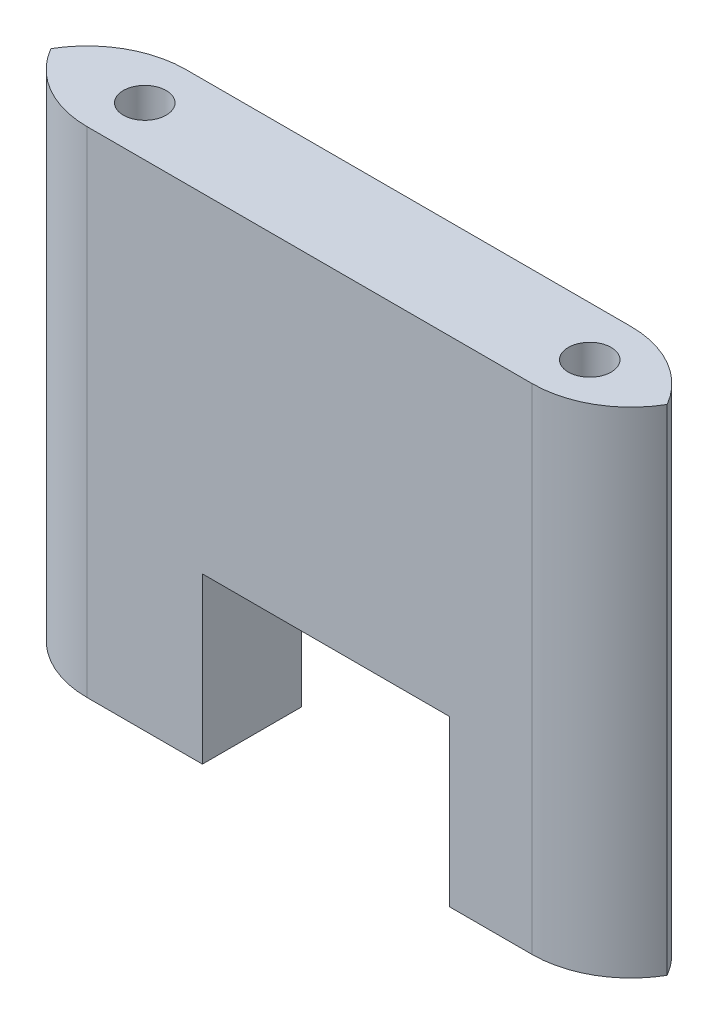
ISO-10303-21;
HEADER;
FILE_DESCRIPTION(('STEP AP214'),'2;1');
FILE_NAME('part.step','',(''),(''),'','','');
FILE_SCHEMA(('AUTOMOTIVE_DESIGN { 1 0 10303 214 1 1 1 1 }'));
ENDSEC;
DATA;
#1=APPLICATION_CONTEXT('core data for automotive mechanical design processes');
#2=APPLICATION_PROTOCOL_DEFINITION('international standard','automotive_design',2000,#1);
#3=PRODUCT_CONTEXT('',#1,'mechanical');
#4=PRODUCT('Part','Part','',(#3));
#5=PRODUCT_RELATED_PRODUCT_CATEGORY('part','',(#4));
#6=PRODUCT_DEFINITION_FORMATION('','',#4);
#7=PRODUCT_DEFINITION_CONTEXT('part definition',#1,'design');
#8=PRODUCT_DEFINITION('design','',#6,#7);
#9=PRODUCT_DEFINITION_SHAPE('','',#8);
#10=(LENGTH_UNIT() NAMED_UNIT(*) SI_UNIT(.MILLI.,.METRE.));
#11=(NAMED_UNIT(*) PLANE_ANGLE_UNIT() SI_UNIT($,.RADIAN.));
#12=(NAMED_UNIT(*) SI_UNIT($,.STERADIAN.) SOLID_ANGLE_UNIT());
#13=UNCERTAINTY_MEASURE_WITH_UNIT(LENGTH_MEASURE(1.E-05),#10,'distance_accuracy_value','');
#14=(GEOMETRIC_REPRESENTATION_CONTEXT(3) GLOBAL_UNCERTAINTY_ASSIGNED_CONTEXT((#13)) GLOBAL_UNIT_ASSIGNED_CONTEXT((#10,
#11,#12)) REPRESENTATION_CONTEXT('',''));
#15=CARTESIAN_POINT('',(0.,0.,0.));
#16=DIRECTION('',(0.,0.,1.));
#17=DIRECTION('',(1.,0.,0.));
#18=AXIS2_PLACEMENT_3D('',#15,#16,#17);
#19=CARTESIAN_POINT('',(0.,0.,7.62));
#20=DIRECTION('',(0.,1.,0.));
#21=DIRECTION('',(0.,0.,1.));
#22=AXIS2_PLACEMENT_3D('',#19,#20,#21);
#23=PLANE('',#22);
#24=CARTESIAN_POINT('',(42.545,0.,3.81));
#25=DIRECTION('',(0.,-1.,0.));
#26=DIRECTION('',(0.,0.,-1.));
#27=AXIS2_PLACEMENT_3D('',#24,#25,#26);
#28=CIRCLE('',#27,1.651);
#29=CARTESIAN_POINT('',(42.545,0.,2.159));
#30=VERTEX_POINT('',#29);
#31=EDGE_CURVE('E146',#30,#30,#28,.T.);
#32=ORIENTED_EDGE('',*,*,#31,.F.);
#33=EDGE_LOOP('',(#32));
#34=FACE_BOUND('',#33,.T.);
#35=CARTESIAN_POINT('',(41.91,0.,7.62));
#36=DIRECTION('',(0.,1.,0.));
#37=DIRECTION('',(0.,0.,1.));
#38=AXIS2_PLACEMENT_3D('',#35,#36,#37);
#39=CIRCLE('',#38,7.62);
#40=CARTESIAN_POINT('',(41.91,0.,0.));
#41=VERTEX_POINT('',#40);
#42=CARTESIAN_POINT('',(48.5091135768374,0.,3.81));
#43=VERTEX_POINT('',#42);
#44=EDGE_CURVE('E183',#41,#43,#39,.F.);
#45=ORIENTED_EDGE('',*,*,#44,.T.);
#46=CARTESIAN_POINT('',(41.91,0.,0.));
#47=DIRECTION('',(0.,1.,0.));
#48=DIRECTION('',(0.,0.,1.));
#49=AXIS2_PLACEMENT_3D('',#46,#47,#48);
#50=CIRCLE('',#49,7.62);
#51=CARTESIAN_POINT('',(41.91,0.,7.62));
#52=VERTEX_POINT('',#51);
#53=EDGE_CURVE('E185',#43,#52,#50,.F.);
#54=ORIENTED_EDGE('',*,*,#53,.T.);
#55=DIRECTION('',(1.,0.,0.));
#56=VECTOR('',#55,1.);
#57=CARTESIAN_POINT('',(0.,0.,7.62));
#58=LINE('',#57,#56);
#59=CARTESIAN_POINT('',(35.56,0.,7.62));
#60=VERTEX_POINT('',#59);
#61=EDGE_CURVE('E162',#60,#52,#58,.T.);
#62=ORIENTED_EDGE('',*,*,#61,.F.);
#63=DIRECTION('',(0.,0.,1.));
#64=VECTOR('',#63,1.);
#65=CARTESIAN_POINT('',(35.56,0.,0.));
#66=LINE('',#65,#64);
#67=CARTESIAN_POINT('',(35.56,0.,0.));
#68=VERTEX_POINT('',#67);
#69=EDGE_CURVE('E153',#68,#60,#66,.T.);
#70=ORIENTED_EDGE('',*,*,#69,.F.);
#71=DIRECTION('',(1.,0.,0.));
#72=VECTOR('',#71,1.);
#73=CARTESIAN_POINT('',(0.,0.,0.));
#74=LINE('',#73,#72);
#75=EDGE_CURVE('E139',#68,#41,#74,.T.);
#76=ORIENTED_EDGE('',*,*,#75,.T.);
#77=EDGE_LOOP('',(#45,#54,#62,#70,#76));
#78=FACE_BOUND('',#77,.T.);
#79=ADVANCED_FACE('F39',(#34,#78),#23,.F.);
#80=CARTESIAN_POINT('',(8.255,0.,3.81));
#81=DIRECTION('',(0.,-1.,0.));
#82=DIRECTION('',(0.,0.,-1.));
#83=AXIS2_PLACEMENT_3D('',#80,#81,#82);
#84=CIRCLE('',#83,1.651);
#85=CARTESIAN_POINT('',(8.255,0.,2.159));
#86=VERTEX_POINT('',#85);
#87=EDGE_CURVE('E417',#86,#86,#84,.T.);
#88=ORIENTED_EDGE('',*,*,#87,.F.);
#89=EDGE_LOOP('',(#88));
#90=FACE_BOUND('',#89,.T.);
#91=CARTESIAN_POINT('',(7.62,0.,0.));
#92=DIRECTION('',(0.,1.,0.));
#93=DIRECTION('',(0.,0.,1.));
#94=AXIS2_PLACEMENT_3D('',#91,#92,#93);
#95=CIRCLE('',#94,7.62);
#96=CARTESIAN_POINT('',(7.62,0.,7.62));
#97=VERTEX_POINT('',#96);
#98=CARTESIAN_POINT('',(1.02088642316258,0.,3.81));
#99=VERTEX_POINT('',#98);
#100=EDGE_CURVE('E48',#97,#99,#95,.F.);
#101=ORIENTED_EDGE('',*,*,#100,.T.);
#102=CARTESIAN_POINT('',(7.62,0.,7.62));
#103=DIRECTION('',(0.,1.,0.));
#104=DIRECTION('',(0.,0.,1.));
#105=AXIS2_PLACEMENT_3D('',#102,#103,#104);
#106=CIRCLE('',#105,7.62);
#107=CARTESIAN_POINT('',(7.62,0.,0.));
#108=VERTEX_POINT('',#107);
#109=EDGE_CURVE('E11',#99,#108,#106,.F.);
#110=ORIENTED_EDGE('',*,*,#109,.T.);
#111=CARTESIAN_POINT('',(16.51,0.,0.));
#112=VERTEX_POINT('',#111);
#113=EDGE_CURVE('E166',#108,#112,#74,.T.);
#114=ORIENTED_EDGE('',*,*,#113,.T.);
#115=DIRECTION('',(0.,0.,1.));
#116=VECTOR('',#115,1.);
#117=CARTESIAN_POINT('',(16.51,0.,0.));
#118=LINE('',#117,#116);
#119=CARTESIAN_POINT('',(16.51,0.,7.62));
#120=VERTEX_POINT('',#119);
#121=EDGE_CURVE('E155',#112,#120,#118,.T.);
#122=ORIENTED_EDGE('',*,*,#121,.T.);
#123=EDGE_CURVE('E159',#97,#120,#58,.T.);
#124=ORIENTED_EDGE('',*,*,#123,.F.);
#125=EDGE_LOOP('',(#101,#110,#114,#122,#124));
#126=FACE_BOUND('',#125,.T.);
#127=ADVANCED_FACE('F227',(#90,#126),#23,.F.);
#128=CARTESIAN_POINT('',(0.,38.1,7.62));
#129=DIRECTION('',(0.,-1.,0.));
#130=DIRECTION('',(0.,0.,-1.));
#131=AXIS2_PLACEMENT_3D('',#128,#129,#130);
#132=PLANE('',#131);
#133=CARTESIAN_POINT('',(8.255,38.1,3.81));
#134=DIRECTION('',(0.,1.,0.));
#135=DIRECTION('',(0.,0.,1.));
#136=AXIS2_PLACEMENT_3D('',#133,#134,#135);
#137=CIRCLE('',#136,1.651);
#138=CARTESIAN_POINT('',(8.255,38.1,5.461));
#139=VERTEX_POINT('',#138);
#140=EDGE_CURVE('E425',#139,#139,#137,.T.);
#141=ORIENTED_EDGE('',*,*,#140,.F.);
#142=EDGE_LOOP('',(#141));
#143=FACE_BOUND('',#142,.T.);
#144=CARTESIAN_POINT('',(42.545,38.1,3.81));
#145=DIRECTION('',(0.,1.,0.));
#146=DIRECTION('',(0.,0.,1.));
#147=AXIS2_PLACEMENT_3D('',#144,#145,#146);
#148=CIRCLE('',#147,1.651);
#149=CARTESIAN_POINT('',(42.545,38.1,5.461));
#150=VERTEX_POINT('',#149);
#151=EDGE_CURVE('E194',#150,#150,#148,.T.);
#152=ORIENTED_EDGE('',*,*,#151,.F.);
#153=EDGE_LOOP('',(#152));
#154=FACE_BOUND('',#153,.T.);
#155=DIRECTION('',(-1.,0.,0.));
#156=VECTOR('',#155,1.);
#157=CARTESIAN_POINT('',(0.,38.1,7.62));
#158=LINE('',#157,#156);
#159=CARTESIAN_POINT('',(41.91,38.1,7.62));
#160=VERTEX_POINT('',#159);
#161=CARTESIAN_POINT('',(7.62,38.1,7.62));
#162=VERTEX_POINT('',#161);
#163=EDGE_CURVE('E161',#160,#162,#158,.T.);
#164=ORIENTED_EDGE('',*,*,#163,.F.);
#165=CARTESIAN_POINT('',(41.91,38.1,0.));
#166=DIRECTION('',(0.,-1.,0.));
#167=DIRECTION('',(0.,0.,-1.));
#168=AXIS2_PLACEMENT_3D('',#165,#166,#167);
#169=CIRCLE('',#168,7.62);
#170=CARTESIAN_POINT('',(48.5091135768374,38.1,3.81));
#171=VERTEX_POINT('',#170);
#172=EDGE_CURVE('E181',#160,#171,#169,.F.);
#173=ORIENTED_EDGE('',*,*,#172,.T.);
#174=CARTESIAN_POINT('',(41.91,38.1,7.62));
#175=DIRECTION('',(0.,-1.,0.));
#176=DIRECTION('',(0.,0.,-1.));
#177=AXIS2_PLACEMENT_3D('',#174,#175,#176);
#178=CIRCLE('',#177,7.62);
#179=CARTESIAN_POINT('',(41.91,38.1,0.));
#180=VERTEX_POINT('',#179);
#181=EDGE_CURVE('E179',#171,#180,#178,.F.);
#182=ORIENTED_EDGE('',*,*,#181,.T.);
#183=DIRECTION('',(-1.,0.,0.));
#184=VECTOR('',#183,1.);
#185=CARTESIAN_POINT('',(0.,38.1,0.));
#186=LINE('',#185,#184);
#187=CARTESIAN_POINT('',(7.62,38.1,0.));
#188=VERTEX_POINT('',#187);
#189=EDGE_CURVE('E168',#180,#188,#186,.T.);
#190=ORIENTED_EDGE('',*,*,#189,.T.);
#191=CARTESIAN_POINT('',(7.62,38.1,7.62));
#192=DIRECTION('',(0.,-1.,0.));
#193=DIRECTION('',(0.,0.,-1.));
#194=AXIS2_PLACEMENT_3D('',#191,#192,#193);
#195=CIRCLE('',#194,7.62);
#196=CARTESIAN_POINT('',(1.02088642316258,38.1,3.81));
#197=VERTEX_POINT('',#196);
#198=EDGE_CURVE('E177',#188,#197,#195,.F.);
#199=ORIENTED_EDGE('',*,*,#198,.T.);
#200=CARTESIAN_POINT('',(7.62,38.1,0.));
#201=DIRECTION('',(0.,-1.,0.));
#202=DIRECTION('',(0.,0.,-1.));
#203=AXIS2_PLACEMENT_3D('',#200,#201,#202);
#204=CIRCLE('',#203,7.62);
#205=EDGE_CURVE('E175',#197,#162,#204,.F.);
#206=ORIENTED_EDGE('',*,*,#205,.T.);
#207=EDGE_LOOP('',(#164,#173,#182,#190,#199,#206));
#208=FACE_BOUND('',#207,.T.);
#209=ADVANCED_FACE('F210',(#143,#154,#208),#132,.F.);
#210=CARTESIAN_POINT('',(0.,0.,7.62));
#211=DIRECTION('',(0.,0.,-1.));
#212=DIRECTION('',(-1.,0.,0.));
#213=AXIS2_PLACEMENT_3D('',#210,#211,#212);
#214=PLANE('',#213);
#215=ORIENTED_EDGE('',*,*,#61,.T.);
#216=DIRECTION('',(0.,1.,0.));
#217=VECTOR('',#216,1.);
#218=CARTESIAN_POINT('',(41.91,0.,7.62));
#219=LINE('',#218,#217);
#220=EDGE_CURVE('E172',#52,#160,#219,.T.);
#221=ORIENTED_EDGE('',*,*,#220,.T.);
#222=ORIENTED_EDGE('',*,*,#163,.T.);
#223=DIRECTION('',(0.,-1.,0.));
#224=VECTOR('',#223,1.);
#225=CARTESIAN_POINT('',(7.62,0.,7.62));
#226=LINE('',#225,#224);
#227=EDGE_CURVE('E165',#162,#97,#226,.T.);
#228=ORIENTED_EDGE('',*,*,#227,.T.);
#229=ORIENTED_EDGE('',*,*,#123,.T.);
#230=DIRECTION('',(0.,-1.,0.));
#231=VECTOR('',#230,1.);
#232=CARTESIAN_POINT('',(16.51,12.7,7.62));
#233=LINE('',#232,#231);
#234=CARTESIAN_POINT('',(16.51,12.7,7.62));
#235=VERTEX_POINT('',#234);
#236=EDGE_CURVE('E140',#235,#120,#233,.T.);
#237=ORIENTED_EDGE('',*,*,#236,.F.);
#238=DIRECTION('',(-1.,0.,0.));
#239=VECTOR('',#238,1.);
#240=CARTESIAN_POINT('',(16.51,12.7,7.62));
#241=LINE('',#240,#239);
#242=CARTESIAN_POINT('',(35.56,12.7,7.62));
#243=VERTEX_POINT('',#242);
#244=EDGE_CURVE('E143',#243,#235,#241,.T.);
#245=ORIENTED_EDGE('',*,*,#244,.F.);
#246=DIRECTION('',(0.,1.,0.));
#247=VECTOR('',#246,1.);
#248=CARTESIAN_POINT('',(35.56,12.7,7.62));
#249=LINE('',#248,#247);
#250=EDGE_CURVE('E121',#60,#243,#249,.T.);
#251=ORIENTED_EDGE('',*,*,#250,.F.);
#252=EDGE_LOOP('',(#215,#221,#222,#228,#229,#237,#245,#251));
#253=FACE_BOUND('',#252,.T.);
#254=ADVANCED_FACE('F213',(#253),#214,.F.);
#255=CARTESIAN_POINT('',(0.,0.,0.));
#256=DIRECTION('',(0.,0.,-1.));
#257=DIRECTION('',(-1.,0.,0.));
#258=AXIS2_PLACEMENT_3D('',#255,#256,#257);
#259=PLANE('',#258);
#260=ORIENTED_EDGE('',*,*,#189,.F.);
#261=DIRECTION('',(0.,1.,0.));
#262=VECTOR('',#261,1.);
#263=CARTESIAN_POINT('',(41.91,0.,0.));
#264=LINE('',#263,#262);
#265=EDGE_CURVE('E190',#180,#41,#264,.F.);
#266=ORIENTED_EDGE('',*,*,#265,.T.);
#267=ORIENTED_EDGE('',*,*,#75,.F.);
#268=DIRECTION('',(0.,1.,0.));
#269=VECTOR('',#268,1.);
#270=CARTESIAN_POINT('',(35.56,12.7,0.));
#271=LINE('',#270,#269);
#272=CARTESIAN_POINT('',(35.56,12.7,0.));
#273=VERTEX_POINT('',#272);
#274=EDGE_CURVE('E118',#68,#273,#271,.T.);
#275=ORIENTED_EDGE('',*,*,#274,.T.);
#276=DIRECTION('',(-1.,0.,0.));
#277=VECTOR('',#276,1.);
#278=CARTESIAN_POINT('',(16.51,12.7,0.));
#279=LINE('',#278,#277);
#280=CARTESIAN_POINT('',(16.51,12.7,0.));
#281=VERTEX_POINT('',#280);
#282=EDGE_CURVE('E130',#273,#281,#279,.T.);
#283=ORIENTED_EDGE('',*,*,#282,.T.);
#284=DIRECTION('',(0.,-1.,0.));
#285=VECTOR('',#284,1.);
#286=CARTESIAN_POINT('',(16.51,12.7,0.));
#287=LINE('',#286,#285);
#288=EDGE_CURVE('E126',#281,#112,#287,.T.);
#289=ORIENTED_EDGE('',*,*,#288,.T.);
#290=ORIENTED_EDGE('',*,*,#113,.F.);
#291=DIRECTION('',(0.,-1.,0.));
#292=VECTOR('',#291,1.);
#293=CARTESIAN_POINT('',(7.62,38.1,0.));
#294=LINE('',#293,#292);
#295=EDGE_CURVE('E187',#108,#188,#294,.F.);
#296=ORIENTED_EDGE('',*,*,#295,.T.);
#297=EDGE_LOOP('',(#260,#266,#267,#275,#283,#289,#290,#296));
#298=FACE_BOUND('',#297,.T.);
#299=ADVANCED_FACE('F137',(#298),#259,.T.);
#300=CARTESIAN_POINT('',(35.56,12.7,0.));
#301=DIRECTION('',(1.,0.,0.));
#302=DIRECTION('',(0.,0.,-1.));
#303=AXIS2_PLACEMENT_3D('',#300,#301,#302);
#304=PLANE('',#303);
#305=ORIENTED_EDGE('',*,*,#250,.T.);
#306=DIRECTION('',(0.,0.,1.));
#307=VECTOR('',#306,1.);
#308=CARTESIAN_POINT('',(35.56,12.7,0.));
#309=LINE('',#308,#307);
#310=EDGE_CURVE('E114',#273,#243,#309,.T.);
#311=ORIENTED_EDGE('',*,*,#310,.F.);
#312=ORIENTED_EDGE('',*,*,#274,.F.);
#313=ORIENTED_EDGE('',*,*,#69,.T.);
#314=EDGE_LOOP('',(#305,#311,#312,#313));
#315=FACE_BOUND('',#314,.T.);
#316=ADVANCED_FACE('F116',(#315),#304,.F.);
#317=CARTESIAN_POINT('',(16.51,12.7,0.));
#318=DIRECTION('',(-1.,0.,0.));
#319=DIRECTION('',(0.,0.,1.));
#320=AXIS2_PLACEMENT_3D('',#317,#318,#319);
#321=PLANE('',#320);
#322=ORIENTED_EDGE('',*,*,#236,.T.);
#323=ORIENTED_EDGE('',*,*,#121,.F.);
#324=ORIENTED_EDGE('',*,*,#288,.F.);
#325=DIRECTION('',(0.,0.,1.));
#326=VECTOR('',#325,1.);
#327=CARTESIAN_POINT('',(16.51,12.7,0.));
#328=LINE('',#327,#326);
#329=EDGE_CURVE('E125',#281,#235,#328,.T.);
#330=ORIENTED_EDGE('',*,*,#329,.T.);
#331=EDGE_LOOP('',(#322,#323,#324,#330));
#332=FACE_BOUND('',#331,.T.);
#333=ADVANCED_FACE('F226',(#332),#321,.F.);
#334=CARTESIAN_POINT('',(16.51,12.7,0.));
#335=DIRECTION('',(0.,1.,0.));
#336=DIRECTION('',(0.,0.,1.));
#337=AXIS2_PLACEMENT_3D('',#334,#335,#336);
#338=PLANE('',#337);
#339=ORIENTED_EDGE('',*,*,#244,.T.);
#340=ORIENTED_EDGE('',*,*,#329,.F.);
#341=ORIENTED_EDGE('',*,*,#282,.F.);
#342=ORIENTED_EDGE('',*,*,#310,.T.);
#343=EDGE_LOOP('',(#339,#340,#341,#342));
#344=FACE_BOUND('',#343,.T.);
#345=ADVANCED_FACE('F131',(#344),#338,.F.);
#346=CARTESIAN_POINT('',(8.255,5.08,3.81));
#347=DIRECTION('',(0.,-1.,0.));
#348=DIRECTION('',(0.,0.,-1.));
#349=AXIS2_PLACEMENT_3D('',#346,#347,#348);
#350=CYLINDRICAL_SURFACE('',#349,1.651);
#351=CARTESIAN_POINT('',(8.255,5.08,3.81));
#352=DIRECTION('',(0.,-1.,0.));
#353=DIRECTION('',(0.,0.,-1.));
#354=AXIS2_PLACEMENT_3D('',#351,#352,#353);
#355=CIRCLE('',#354,1.651);
#356=CARTESIAN_POINT('',(8.255,5.08,2.159));
#357=VERTEX_POINT('',#356);
#358=EDGE_CURVE('E151',#357,#357,#355,.T.);
#359=ORIENTED_EDGE('',*,*,#358,.F.);
#360=EDGE_LOOP('',(#359));
#361=FACE_BOUND('',#360,.T.);
#362=ORIENTED_EDGE('',*,*,#87,.T.);
#363=EDGE_LOOP('',(#362));
#364=FACE_BOUND('',#363,.T.);
#365=ADVANCED_FACE('F315',(#361,#364),#350,.F.);
#366=CARTESIAN_POINT('',(8.255,5.08,3.81));
#367=DIRECTION('',(0.,-1.,0.));
#368=DIRECTION('',(0.,0.,-1.));
#369=AXIS2_PLACEMENT_3D('',#366,#367,#368);
#370=PLANE('',#369);
#371=ORIENTED_EDGE('',*,*,#358,.T.);
#372=EDGE_LOOP('',(#371));
#373=FACE_BOUND('',#372,.T.);
#374=ADVANCED_FACE('F307',(#373),#370,.T.);
#375=CARTESIAN_POINT('',(42.545,5.08,3.81));
#376=DIRECTION('',(0.,-1.,0.));
#377=DIRECTION('',(0.,0.,-1.));
#378=AXIS2_PLACEMENT_3D('',#375,#376,#377);
#379=CYLINDRICAL_SURFACE('',#378,1.651);
#380=CARTESIAN_POINT('',(42.545,5.08,3.81));
#381=DIRECTION('',(0.,-1.,0.));
#382=DIRECTION('',(0.,0.,-1.));
#383=AXIS2_PLACEMENT_3D('',#380,#381,#382);
#384=CIRCLE('',#383,1.651);
#385=CARTESIAN_POINT('',(42.545,5.08,2.159));
#386=VERTEX_POINT('',#385);
#387=EDGE_CURVE('E418',#386,#386,#384,.T.);
#388=ORIENTED_EDGE('',*,*,#387,.F.);
#389=EDGE_LOOP('',(#388));
#390=FACE_BOUND('',#389,.T.);
#391=ORIENTED_EDGE('',*,*,#31,.T.);
#392=EDGE_LOOP('',(#391));
#393=FACE_BOUND('',#392,.T.);
#394=ADVANCED_FACE('F299',(#390,#393),#379,.F.);
#395=CARTESIAN_POINT('',(42.545,5.08,3.81));
#396=DIRECTION('',(0.,-1.,0.));
#397=DIRECTION('',(0.,0.,-1.));
#398=AXIS2_PLACEMENT_3D('',#395,#396,#397);
#399=PLANE('',#398);
#400=ORIENTED_EDGE('',*,*,#387,.T.);
#401=EDGE_LOOP('',(#400));
#402=FACE_BOUND('',#401,.T.);
#403=ADVANCED_FACE('F291',(#402),#399,.T.);
#404=CARTESIAN_POINT('',(42.545,33.02,3.81));
#405=DIRECTION('',(0.,1.,0.));
#406=DIRECTION('',(0.,0.,1.));
#407=AXIS2_PLACEMENT_3D('',#404,#405,#406);
#408=CYLINDRICAL_SURFACE('',#407,1.651);
#409=CARTESIAN_POINT('',(42.545,33.02,3.81));
#410=DIRECTION('',(0.,1.,0.));
#411=DIRECTION('',(0.,0.,1.));
#412=AXIS2_PLACEMENT_3D('',#409,#410,#411);
#413=CIRCLE('',#412,1.651);
#414=CARTESIAN_POINT('',(42.545,33.02,5.461));
#415=VERTEX_POINT('',#414);
#416=EDGE_CURVE('E199',#415,#415,#413,.T.);
#417=ORIENTED_EDGE('',*,*,#416,.F.);
#418=EDGE_LOOP('',(#417));
#419=FACE_BOUND('',#418,.T.);
#420=ORIENTED_EDGE('',*,*,#151,.T.);
#421=EDGE_LOOP('',(#420));
#422=FACE_BOUND('',#421,.T.);
#423=ADVANCED_FACE('F283',(#419,#422),#408,.F.);
#424=CARTESIAN_POINT('',(42.545,33.02,3.81));
#425=DIRECTION('',(0.,1.,0.));
#426=DIRECTION('',(0.,0.,1.));
#427=AXIS2_PLACEMENT_3D('',#424,#425,#426);
#428=PLANE('',#427);
#429=ORIENTED_EDGE('',*,*,#416,.T.);
#430=EDGE_LOOP('',(#429));
#431=FACE_BOUND('',#430,.T.);
#432=ADVANCED_FACE('F275',(#431),#428,.T.);
#433=CARTESIAN_POINT('',(8.255,33.02,3.81));
#434=DIRECTION('',(0.,1.,0.));
#435=DIRECTION('',(0.,0.,1.));
#436=AXIS2_PLACEMENT_3D('',#433,#434,#435);
#437=CYLINDRICAL_SURFACE('',#436,1.651);
#438=CARTESIAN_POINT('',(8.255,33.02,3.81));
#439=DIRECTION('',(0.,1.,0.));
#440=DIRECTION('',(0.,0.,1.));
#441=AXIS2_PLACEMENT_3D('',#438,#439,#440);
#442=CIRCLE('',#441,1.651);
#443=CARTESIAN_POINT('',(8.255,33.02,5.461));
#444=VERTEX_POINT('',#443);
#445=EDGE_CURVE('E428',#444,#444,#442,.T.);
#446=ORIENTED_EDGE('',*,*,#445,.F.);
#447=EDGE_LOOP('',(#446));
#448=FACE_BOUND('',#447,.T.);
#449=ORIENTED_EDGE('',*,*,#140,.T.);
#450=EDGE_LOOP('',(#449));
#451=FACE_BOUND('',#450,.T.);
#452=ADVANCED_FACE('F266',(#448,#451),#437,.F.);
#453=CARTESIAN_POINT('',(8.255,33.02,3.81));
#454=DIRECTION('',(0.,1.,0.));
#455=DIRECTION('',(0.,0.,1.));
#456=AXIS2_PLACEMENT_3D('',#453,#454,#455);
#457=PLANE('',#456);
#458=ORIENTED_EDGE('',*,*,#445,.T.);
#459=EDGE_LOOP('',(#458));
#460=FACE_BOUND('',#459,.T.);
#461=ADVANCED_FACE('F244',(#460),#457,.T.);
#462=CARTESIAN_POINT('',(41.91,0.,7.62));
#463=DIRECTION('',(0.,-1.,0.));
#464=DIRECTION('',(1.,0.,0.));
#465=AXIS2_PLACEMENT_3D('',#462,#463,#464);
#466=CYLINDRICAL_SURFACE('',#465,7.62);
#467=DIRECTION('',(0.,-1.,0.));
#468=VECTOR('',#467,1.);
#469=CARTESIAN_POINT('',(48.5091135768374,19.05,3.81000000000001));
#470=LINE('',#469,#468);
#471=EDGE_CURVE('E192',#43,#171,#470,.F.);
#472=ORIENTED_EDGE('',*,*,#471,.F.);
#473=ORIENTED_EDGE('',*,*,#44,.F.);
#474=ORIENTED_EDGE('',*,*,#265,.F.);
#475=ORIENTED_EDGE('',*,*,#181,.F.);
#476=EDGE_LOOP('',(#472,#473,#474,#475));
#477=FACE_BOUND('',#476,.T.);
#478=ADVANCED_FACE('F220',(#477),#466,.T.);
#479=CARTESIAN_POINT('',(41.91,0.,0.));
#480=DIRECTION('',(0.,1.,0.));
#481=DIRECTION('',(-1.,0.,0.));
#482=AXIS2_PLACEMENT_3D('',#479,#480,#481);
#483=CYLINDRICAL_SURFACE('',#482,7.62);
#484=ORIENTED_EDGE('',*,*,#53,.F.);
#485=ORIENTED_EDGE('',*,*,#471,.T.);
#486=ORIENTED_EDGE('',*,*,#172,.F.);
#487=ORIENTED_EDGE('',*,*,#220,.F.);
#488=EDGE_LOOP('',(#484,#485,#486,#487));
#489=FACE_BOUND('',#488,.T.);
#490=ADVANCED_FACE('F216',(#489),#483,.T.);
#491=CARTESIAN_POINT('',(7.62,0.,0.));
#492=DIRECTION('',(0.,-1.,0.));
#493=DIRECTION('',(0.,0.,-1.));
#494=AXIS2_PLACEMENT_3D('',#491,#492,#493);
#495=CYLINDRICAL_SURFACE('',#494,7.62);
#496=ORIENTED_EDGE('',*,*,#227,.F.);
#497=ORIENTED_EDGE('',*,*,#205,.F.);
#498=DIRECTION('',(0.,-1.,0.));
#499=VECTOR('',#498,1.);
#500=CARTESIAN_POINT('',(1.02088642316258,19.05,3.81));
#501=LINE('',#500,#499);
#502=EDGE_CURVE('E43',#99,#197,#501,.F.);
#503=ORIENTED_EDGE('',*,*,#502,.F.);
#504=ORIENTED_EDGE('',*,*,#100,.F.);
#505=EDGE_LOOP('',(#496,#497,#503,#504));
#506=FACE_BOUND('',#505,.T.);
#507=ADVANCED_FACE('F41',(#506),#495,.T.);
#508=CARTESIAN_POINT('',(7.62,0.,7.62));
#509=DIRECTION('',(0.,1.,0.));
#510=DIRECTION('',(0.,0.,1.));
#511=AXIS2_PLACEMENT_3D('',#508,#509,#510);
#512=CYLINDRICAL_SURFACE('',#511,7.62);
#513=ORIENTED_EDGE('',*,*,#198,.F.);
#514=ORIENTED_EDGE('',*,*,#295,.F.);
#515=ORIENTED_EDGE('',*,*,#109,.F.);
#516=ORIENTED_EDGE('',*,*,#502,.T.);
#517=EDGE_LOOP('',(#513,#514,#515,#516));
#518=FACE_BOUND('',#517,.T.);
#519=ADVANCED_FACE('F203',(#518),#512,.T.);
#520=CLOSED_SHELL('',(#79,#127,#209,#254,#299,#316,#333,#345,#365,#374,#394,#403,#423,#432,#452,
#461,#478,#490,#507,#519));
#521=MANIFOLD_SOLID_BREP('B2',#520);
#522=ADVANCED_BREP_SHAPE_REPRESENTATION('',(#18,#521),#14);
#523=SHAPE_DEFINITION_REPRESENTATION(#9,#522);
ENDSEC;
END-ISO-10303-21;
